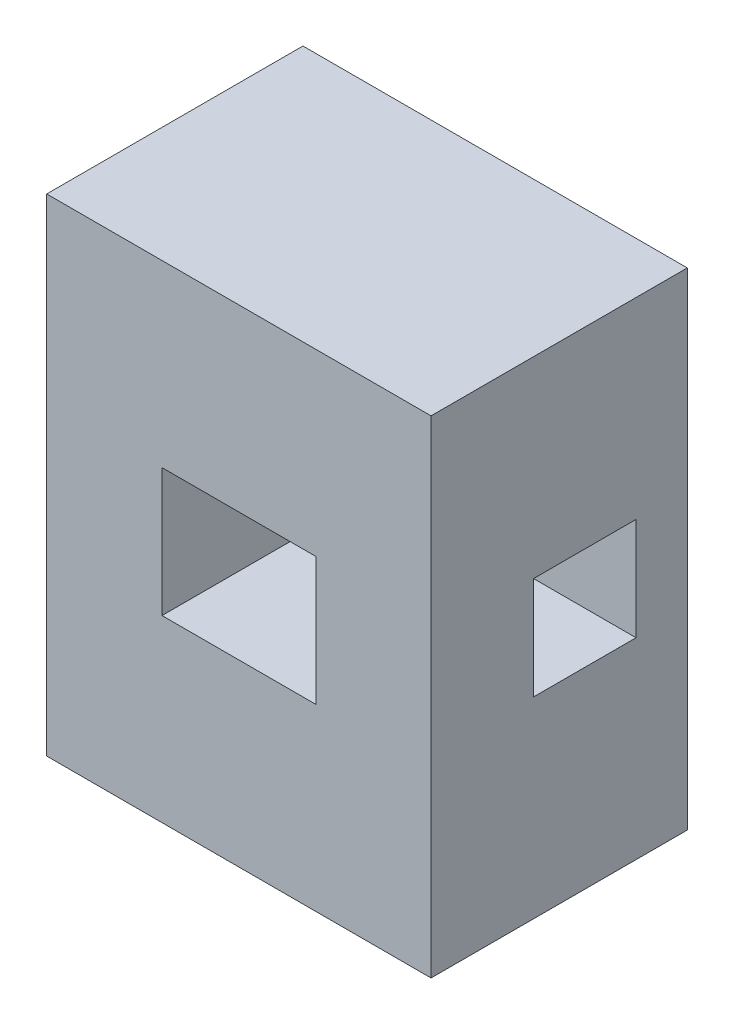
ISO-10303-21;
HEADER;
FILE_DESCRIPTION(('STEP AP214'),'2;1');
FILE_NAME('part.step','',(''),(''),'','','');
FILE_SCHEMA(('AUTOMOTIVE_DESIGN { 1 0 10303 214 1 1 1 1 }'));
ENDSEC;
DATA;
#1=APPLICATION_CONTEXT('core data for automotive mechanical design processes');
#2=APPLICATION_PROTOCOL_DEFINITION('international standard','automotive_design',2000,#1);
#3=PRODUCT_CONTEXT('',#1,'mechanical');
#4=PRODUCT('Part','Part','',(#3));
#5=PRODUCT_RELATED_PRODUCT_CATEGORY('part','',(#4));
#6=PRODUCT_DEFINITION_FORMATION('','',#4);
#7=PRODUCT_DEFINITION_CONTEXT('part definition',#1,'design');
#8=PRODUCT_DEFINITION('design','',#6,#7);
#9=PRODUCT_DEFINITION_SHAPE('','',#8);
#10=(LENGTH_UNIT() NAMED_UNIT(*) SI_UNIT(.MILLI.,.METRE.));
#11=(NAMED_UNIT(*) PLANE_ANGLE_UNIT() SI_UNIT($,.RADIAN.));
#12=(NAMED_UNIT(*) SI_UNIT($,.STERADIAN.) SOLID_ANGLE_UNIT());
#13=UNCERTAINTY_MEASURE_WITH_UNIT(LENGTH_MEASURE(1.E-05),#10,'distance_accuracy_value','');
#14=(GEOMETRIC_REPRESENTATION_CONTEXT(3) GLOBAL_UNCERTAINTY_ASSIGNED_CONTEXT((#13)) GLOBAL_UNIT_ASSIGNED_CONTEXT((#10,
#11,#12)) REPRESENTATION_CONTEXT('',''));
#15=CARTESIAN_POINT('',(0.,0.,0.));
#16=DIRECTION('',(0.,0.,1.));
#17=DIRECTION('',(1.,0.,0.));
#18=AXIS2_PLACEMENT_3D('',#15,#16,#17);
#19=CARTESIAN_POINT('',(21.,14.,-38.));
#20=DIRECTION('',(1.,0.,0.));
#21=DIRECTION('',(0.,0.,-1.));
#22=AXIS2_PLACEMENT_3D('',#19,#20,#21);
#23=PLANE('',#22);
#24=DIRECTION('',(0.,0.,1.));
#25=VECTOR('',#24,1.);
#26=CARTESIAN_POINT('',(21.,15.,-7.99999999999999));
#27=LINE('',#26,#25);
#28=CARTESIAN_POINT('',(21.,15.,-16.));
#29=VERTEX_POINT('',#28);
#30=CARTESIAN_POINT('',(21.,15.,-7.99999999999999));
#31=VERTEX_POINT('',#30);
#32=EDGE_CURVE('E155',#29,#31,#27,.T.);
#33=ORIENTED_EDGE('',*,*,#32,.F.);
#34=DIRECTION('',(0.,-1.,0.));
#35=VECTOR('',#34,1.);
#36=CARTESIAN_POINT('',(21.,15.,-16.));
#37=LINE('',#36,#35);
#38=CARTESIAN_POINT('',(21.,23.,-16.));
#39=VERTEX_POINT('',#38);
#40=EDGE_CURVE('E158',#39,#29,#37,.T.);
#41=ORIENTED_EDGE('',*,*,#40,.F.);
#42=DIRECTION('',(0.,0.,-1.));
#43=VECTOR('',#42,1.);
#44=CARTESIAN_POINT('',(21.,23.,-7.99999999999999));
#45=LINE('',#44,#43);
#46=CARTESIAN_POINT('',(21.,23.,-7.99999999999999));
#47=VERTEX_POINT('',#46);
#48=EDGE_CURVE('E160',#47,#39,#45,.T.);
#49=ORIENTED_EDGE('',*,*,#48,.F.);
#50=DIRECTION('',(0.,1.,0.));
#51=VECTOR('',#50,1.);
#52=CARTESIAN_POINT('',(21.,15.,-7.99999999999999));
#53=LINE('',#52,#51);
#54=EDGE_CURVE('E152',#31,#47,#53,.T.);
#55=ORIENTED_EDGE('',*,*,#54,.F.);
#56=EDGE_LOOP('',(#33,#41,#49,#55));
#57=FACE_BOUND('',#56,.T.);
#58=DIRECTION('',(0.,1.,0.));
#59=VECTOR('',#58,1.);
#60=CARTESIAN_POINT('',(21.,24.,-18.));
#61=LINE('',#60,#59);
#62=CARTESIAN_POINT('',(21.,14.,-18.));
#63=VERTEX_POINT('',#62);
#64=CARTESIAN_POINT('',(21.,24.,-18.));
#65=VERTEX_POINT('',#64);
#66=EDGE_CURVE('E54',#63,#65,#61,.T.);
#67=ORIENTED_EDGE('',*,*,#66,.F.);
#68=DIRECTION('',(0.,0.,1.));
#69=VECTOR('',#68,1.);
#70=CARTESIAN_POINT('',(21.,14.,-38.));
#71=LINE('',#70,#69);
#72=CARTESIAN_POINT('',(21.,14.,0.));
#73=VERTEX_POINT('',#72);
#74=EDGE_CURVE('E189',#63,#73,#71,.T.);
#75=ORIENTED_EDGE('',*,*,#74,.T.);
#76=DIRECTION('',(0.,1.,0.));
#77=VECTOR('',#76,1.);
#78=CARTESIAN_POINT('',(21.,14.,0.));
#79=LINE('',#78,#77);
#80=CARTESIAN_POINT('',(21.,24.,0.));
#81=VERTEX_POINT('',#80);
#82=EDGE_CURVE('E180',#73,#81,#79,.T.);
#83=ORIENTED_EDGE('',*,*,#82,.T.);
#84=DIRECTION('',(0.,0.,1.));
#85=VECTOR('',#84,1.);
#86=CARTESIAN_POINT('',(21.,24.,-38.));
#87=LINE('',#86,#85);
#88=EDGE_CURVE('E139',#65,#81,#87,.T.);
#89=ORIENTED_EDGE('',*,*,#88,.F.);
#90=EDGE_LOOP('',(#67,#75,#83,#89));
#91=FACE_BOUND('',#90,.T.);
#92=ADVANCED_FACE('F39',(#57,#91),#23,.F.);
#93=CARTESIAN_POINT('',(9.,14.,-38.));
#94=DIRECTION('',(0.,-1.,0.));
#95=DIRECTION('',(0.,0.,-1.));
#96=AXIS2_PLACEMENT_3D('',#93,#94,#95);
#97=PLANE('',#96);
#98=DIRECTION('',(1.,0.,0.));
#99=VECTOR('',#98,1.);
#100=CARTESIAN_POINT('',(-1.19803902718557,14.,-18.));
#101=LINE('',#100,#99);
#102=CARTESIAN_POINT('',(9.,14.,-18.));
#103=VERTEX_POINT('',#102);
#104=EDGE_CURVE('E61',#103,#63,#101,.T.);
#105=ORIENTED_EDGE('',*,*,#104,.F.);
#106=DIRECTION('',(0.,0.,1.));
#107=VECTOR('',#106,1.);
#108=CARTESIAN_POINT('',(9.,14.,-38.));
#109=LINE('',#108,#107);
#110=CARTESIAN_POINT('',(9.,14.,0.));
#111=VERTEX_POINT('',#110);
#112=EDGE_CURVE('E138',#103,#111,#109,.T.);
#113=ORIENTED_EDGE('',*,*,#112,.T.);
#114=DIRECTION('',(1.,0.,0.));
#115=VECTOR('',#114,1.);
#116=CARTESIAN_POINT('',(9.,14.,0.));
#117=LINE('',#116,#115);
#118=EDGE_CURVE('E186',#111,#73,#117,.T.);
#119=ORIENTED_EDGE('',*,*,#118,.T.);
#120=ORIENTED_EDGE('',*,*,#74,.F.);
#121=EDGE_LOOP('',(#105,#113,#119,#120));
#122=FACE_BOUND('',#121,.T.);
#123=ADVANCED_FACE('F247',(#122),#97,.F.);
#124=CARTESIAN_POINT('',(9.,14.,-38.));
#125=DIRECTION('',(-1.,0.,0.));
#126=DIRECTION('',(0.,0.,1.));
#127=AXIS2_PLACEMENT_3D('',#124,#125,#126);
#128=PLANE('',#127);
#129=DIRECTION('',(0.,1.,0.));
#130=VECTOR('',#129,1.);
#131=CARTESIAN_POINT('',(9.,24.,-18.));
#132=LINE('',#131,#130);
#133=CARTESIAN_POINT('',(9.,24.,-18.));
#134=VERTEX_POINT('',#133);
#135=EDGE_CURVE('E142',#103,#134,#132,.T.);
#136=ORIENTED_EDGE('',*,*,#135,.T.);
#137=DIRECTION('',(0.,0.,1.));
#138=VECTOR('',#137,1.);
#139=CARTESIAN_POINT('',(9.,24.,-38.));
#140=LINE('',#139,#138);
#141=CARTESIAN_POINT('',(9.,24.,0.));
#142=VERTEX_POINT('',#141);
#143=EDGE_CURVE('E128',#134,#142,#140,.T.);
#144=ORIENTED_EDGE('',*,*,#143,.T.);
#145=DIRECTION('',(0.,-1.,0.));
#146=VECTOR('',#145,1.);
#147=CARTESIAN_POINT('',(9.,14.,0.));
#148=LINE('',#147,#146);
#149=EDGE_CURVE('E184',#142,#111,#148,.T.);
#150=ORIENTED_EDGE('',*,*,#149,.T.);
#151=ORIENTED_EDGE('',*,*,#112,.F.);
#152=EDGE_LOOP('',(#136,#144,#150,#151));
#153=FACE_BOUND('',#152,.T.);
#154=ADVANCED_FACE('F143',(#153),#128,.F.);
#155=CARTESIAN_POINT('',(9.,24.,-38.));
#156=DIRECTION('',(0.,1.,0.));
#157=DIRECTION('',(0.,0.,1.));
#158=AXIS2_PLACEMENT_3D('',#155,#156,#157);
#159=PLANE('',#158);
#160=DIRECTION('',(1.,0.,0.));
#161=VECTOR('',#160,1.);
#162=CARTESIAN_POINT('',(-1.19803902718557,24.,-18.));
#163=LINE('',#162,#161);
#164=EDGE_CURVE('E132',#134,#65,#163,.T.);
#165=ORIENTED_EDGE('',*,*,#164,.T.);
#166=ORIENTED_EDGE('',*,*,#88,.T.);
#167=DIRECTION('',(-1.,0.,0.));
#168=VECTOR('',#167,1.);
#169=CARTESIAN_POINT('',(9.,24.,0.));
#170=LINE('',#169,#168);
#171=EDGE_CURVE('E134',#81,#142,#170,.T.);
#172=ORIENTED_EDGE('',*,*,#171,.T.);
#173=ORIENTED_EDGE('',*,*,#143,.F.);
#174=EDGE_LOOP('',(#165,#166,#172,#173));
#175=FACE_BOUND('',#174,.T.);
#176=ADVANCED_FACE('F130',(#175),#159,.F.);
#177=CARTESIAN_POINT('',(0.,38.,0.));
#178=DIRECTION('',(1.,0.,0.));
#179=DIRECTION('',(0.,0.,-1.));
#180=AXIS2_PLACEMENT_3D('',#177,#178,#179);
#181=PLANE('',#180);
#182=DIRECTION('',(0.,0.,1.));
#183=VECTOR('',#182,1.);
#184=CARTESIAN_POINT('',(0.,0.,0.));
#185=LINE('',#184,#183);
#186=CARTESIAN_POINT('',(0.,0.,-20.));
#187=VERTEX_POINT('',#186);
#188=CARTESIAN_POINT('',(0.,0.,0.));
#189=VERTEX_POINT('',#188);
#190=EDGE_CURVE('E191',#187,#189,#185,.T.);
#191=ORIENTED_EDGE('',*,*,#190,.T.);
#192=DIRECTION('',(0.,-1.,0.));
#193=VECTOR('',#192,1.);
#194=CARTESIAN_POINT('',(0.,38.,0.));
#195=LINE('',#194,#193);
#196=CARTESIAN_POINT('',(0.,38.,0.));
#197=VERTEX_POINT('',#196);
#198=EDGE_CURVE('E11',#197,#189,#195,.T.);
#199=ORIENTED_EDGE('',*,*,#198,.F.);
#200=DIRECTION('',(0.,0.,1.));
#201=VECTOR('',#200,1.);
#202=CARTESIAN_POINT('',(0.,38.,0.));
#203=LINE('',#202,#201);
#204=CARTESIAN_POINT('',(0.,38.,-20.));
#205=VERTEX_POINT('',#204);
#206=EDGE_CURVE('E194',#205,#197,#203,.T.);
#207=ORIENTED_EDGE('',*,*,#206,.F.);
#208=DIRECTION('',(0.,-1.,0.));
#209=VECTOR('',#208,1.);
#210=CARTESIAN_POINT('',(0.,38.,-20.));
#211=LINE('',#210,#209);
#212=EDGE_CURVE('E204',#205,#187,#211,.T.);
#213=ORIENTED_EDGE('',*,*,#212,.T.);
#214=EDGE_LOOP('',(#191,#199,#207,#213));
#215=FACE_BOUND('',#214,.T.);
#216=ADVANCED_FACE('F41',(#215),#181,.F.);
#217=CARTESIAN_POINT('',(0.,38.,0.));
#218=DIRECTION('',(0.,0.,-1.));
#219=DIRECTION('',(-1.,0.,0.));
#220=AXIS2_PLACEMENT_3D('',#217,#218,#219);
#221=PLANE('',#220);
#222=ORIENTED_EDGE('',*,*,#171,.F.);
#223=ORIENTED_EDGE('',*,*,#82,.F.);
#224=ORIENTED_EDGE('',*,*,#118,.F.);
#225=ORIENTED_EDGE('',*,*,#149,.F.);
#226=EDGE_LOOP('',(#222,#223,#224,#225));
#227=FACE_BOUND('',#226,.T.);
#228=DIRECTION('',(1.,0.,0.));
#229=VECTOR('',#228,1.);
#230=CARTESIAN_POINT('',(0.,0.,0.));
#231=LINE('',#230,#229);
#232=CARTESIAN_POINT('',(30.,0.,0.));
#233=VERTEX_POINT('',#232);
#234=EDGE_CURVE('E207',#189,#233,#231,.T.);
#235=ORIENTED_EDGE('',*,*,#234,.T.);
#236=DIRECTION('',(0.,-1.,0.));
#237=VECTOR('',#236,1.);
#238=CARTESIAN_POINT('',(30.,38.,0.));
#239=LINE('',#238,#237);
#240=CARTESIAN_POINT('',(30.,38.,0.));
#241=VERTEX_POINT('',#240);
#242=EDGE_CURVE('E47',#241,#233,#239,.T.);
#243=ORIENTED_EDGE('',*,*,#242,.F.);
#244=DIRECTION('',(1.,0.,0.));
#245=VECTOR('',#244,1.);
#246=CARTESIAN_POINT('',(0.,38.,0.));
#247=LINE('',#246,#245);
#248=EDGE_CURVE('E197',#197,#241,#247,.T.);
#249=ORIENTED_EDGE('',*,*,#248,.F.);
#250=ORIENTED_EDGE('',*,*,#198,.T.);
#251=EDGE_LOOP('',(#235,#243,#249,#250));
#252=FACE_BOUND('',#251,.T.);
#253=ADVANCED_FACE('F237',(#227,#252),#221,.F.);
#254=CARTESIAN_POINT('',(30.,38.,0.));
#255=DIRECTION('',(-1.,0.,0.));
#256=DIRECTION('',(0.,0.,1.));
#257=AXIS2_PLACEMENT_3D('',#254,#255,#256);
#258=PLANE('',#257);
#259=DIRECTION('',(0.,0.,1.));
#260=VECTOR('',#259,1.);
#261=CARTESIAN_POINT('',(30.,23.,-8.));
#262=LINE('',#261,#260);
#263=CARTESIAN_POINT('',(30.,23.,-16.));
#264=VERTEX_POINT('',#263);
#265=CARTESIAN_POINT('',(30.,23.,-8.));
#266=VERTEX_POINT('',#265);
#267=EDGE_CURVE('E162',#264,#266,#262,.T.);
#268=ORIENTED_EDGE('',*,*,#267,.F.);
#269=DIRECTION('',(0.,1.,0.));
#270=VECTOR('',#269,1.);
#271=CARTESIAN_POINT('',(30.,15.,-16.));
#272=LINE('',#271,#270);
#273=CARTESIAN_POINT('',(30.,15.,-16.));
#274=VERTEX_POINT('',#273);
#275=EDGE_CURVE('E145',#274,#264,#272,.T.);
#276=ORIENTED_EDGE('',*,*,#275,.F.);
#277=DIRECTION('',(0.,0.,-1.));
#278=VECTOR('',#277,1.);
#279=CARTESIAN_POINT('',(30.,15.,-8.));
#280=LINE('',#279,#278);
#281=CARTESIAN_POINT('',(30.,15.,-8.));
#282=VERTEX_POINT('',#281);
#283=EDGE_CURVE('E168',#282,#274,#280,.T.);
#284=ORIENTED_EDGE('',*,*,#283,.F.);
#285=DIRECTION('',(0.,-1.,0.));
#286=VECTOR('',#285,1.);
#287=CARTESIAN_POINT('',(30.,15.,-8.));
#288=LINE('',#287,#286);
#289=EDGE_CURVE('E165',#266,#282,#288,.T.);
#290=ORIENTED_EDGE('',*,*,#289,.F.);
#291=EDGE_LOOP('',(#268,#276,#284,#290));
#292=FACE_BOUND('',#291,.T.);
#293=DIRECTION('',(0.,0.,-1.));
#294=VECTOR('',#293,1.);
#295=CARTESIAN_POINT('',(30.,0.,0.));
#296=LINE('',#295,#294);
#297=CARTESIAN_POINT('',(30.,0.,-20.));
#298=VERTEX_POINT('',#297);
#299=EDGE_CURVE('E209',#233,#298,#296,.T.);
#300=ORIENTED_EDGE('',*,*,#299,.T.);
#301=DIRECTION('',(0.,-1.,0.));
#302=VECTOR('',#301,1.);
#303=CARTESIAN_POINT('',(30.,38.,-20.));
#304=LINE('',#303,#302);
#305=CARTESIAN_POINT('',(30.,38.,-20.));
#306=VERTEX_POINT('',#305);
#307=EDGE_CURVE('E214',#306,#298,#304,.T.);
#308=ORIENTED_EDGE('',*,*,#307,.F.);
#309=DIRECTION('',(0.,0.,-1.));
#310=VECTOR('',#309,1.);
#311=CARTESIAN_POINT('',(30.,38.,0.));
#312=LINE('',#311,#310);
#313=EDGE_CURVE('E200',#241,#306,#312,.T.);
#314=ORIENTED_EDGE('',*,*,#313,.F.);
#315=ORIENTED_EDGE('',*,*,#242,.T.);
#316=EDGE_LOOP('',(#300,#308,#314,#315));
#317=FACE_BOUND('',#316,.T.);
#318=ADVANCED_FACE('F221',(#292,#317),#258,.F.);
#319=CARTESIAN_POINT('',(0.,38.,-20.));
#320=DIRECTION('',(0.,0.,1.));
#321=DIRECTION('',(1.,0.,0.));
#322=AXIS2_PLACEMENT_3D('',#319,#320,#321);
#323=PLANE('',#322);
#324=DIRECTION('',(-1.,0.,0.));
#325=VECTOR('',#324,1.);
#326=CARTESIAN_POINT('',(0.,0.,-20.));
#327=LINE('',#326,#325);
#328=EDGE_CURVE('E198',#298,#187,#327,.T.);
#329=ORIENTED_EDGE('',*,*,#328,.T.);
#330=ORIENTED_EDGE('',*,*,#212,.F.);
#331=DIRECTION('',(-1.,0.,0.));
#332=VECTOR('',#331,1.);
#333=CARTESIAN_POINT('',(0.,38.,-20.));
#334=LINE('',#333,#332);
#335=EDGE_CURVE('E202',#306,#205,#334,.T.);
#336=ORIENTED_EDGE('',*,*,#335,.F.);
#337=ORIENTED_EDGE('',*,*,#307,.T.);
#338=EDGE_LOOP('',(#329,#330,#336,#337));
#339=FACE_BOUND('',#338,.T.);
#340=ADVANCED_FACE('F230',(#339),#323,.F.);
#341=CARTESIAN_POINT('',(0.,38.,0.));
#342=DIRECTION('',(0.,-1.,0.));
#343=DIRECTION('',(0.,0.,-1.));
#344=AXIS2_PLACEMENT_3D('',#341,#342,#343);
#345=PLANE('',#344);
#346=ORIENTED_EDGE('',*,*,#206,.T.);
#347=ORIENTED_EDGE('',*,*,#248,.T.);
#348=ORIENTED_EDGE('',*,*,#313,.T.);
#349=ORIENTED_EDGE('',*,*,#335,.T.);
#350=EDGE_LOOP('',(#346,#347,#348,#349));
#351=FACE_BOUND('',#350,.T.);
#352=ADVANCED_FACE('F236',(#351),#345,.F.);
#353=CARTESIAN_POINT('',(0.,0.,0.));
#354=DIRECTION('',(0.,-1.,0.));
#355=DIRECTION('',(0.,0.,-1.));
#356=AXIS2_PLACEMENT_3D('',#353,#354,#355);
#357=PLANE('',#356);
#358=ORIENTED_EDGE('',*,*,#190,.F.);
#359=ORIENTED_EDGE('',*,*,#328,.F.);
#360=ORIENTED_EDGE('',*,*,#299,.F.);
#361=ORIENTED_EDGE('',*,*,#234,.F.);
#362=EDGE_LOOP('',(#358,#359,#360,#361));
#363=FACE_BOUND('',#362,.T.);
#364=ADVANCED_FACE('F227',(#363),#357,.T.);
#365=CARTESIAN_POINT('',(9.68629150101523,15.,-16.));
#366=DIRECTION('',(0.,0.,-1.));
#367=DIRECTION('',(-1.,0.,0.));
#368=AXIS2_PLACEMENT_3D('',#365,#366,#367);
#369=PLANE('',#368);
#370=ORIENTED_EDGE('',*,*,#40,.T.);
#371=DIRECTION('',(1.,0.,0.));
#372=VECTOR('',#371,1.);
#373=CARTESIAN_POINT('',(9.68629150101523,15.,-16.));
#374=LINE('',#373,#372);
#375=EDGE_CURVE('E156',#29,#274,#374,.T.);
#376=ORIENTED_EDGE('',*,*,#375,.T.);
#377=ORIENTED_EDGE('',*,*,#275,.T.);
#378=DIRECTION('',(1.,0.,0.));
#379=VECTOR('',#378,1.);
#380=CARTESIAN_POINT('',(9.68629150101523,23.,-16.));
#381=LINE('',#380,#379);
#382=EDGE_CURVE('E171',#39,#264,#381,.T.);
#383=ORIENTED_EDGE('',*,*,#382,.F.);
#384=EDGE_LOOP('',(#370,#376,#377,#383));
#385=FACE_BOUND('',#384,.T.);
#386=ADVANCED_FACE('F262',(#385),#369,.F.);
#387=CARTESIAN_POINT('',(9.68629150101524,15.,-7.99999999999999));
#388=DIRECTION('',(0.,-1.,0.));
#389=DIRECTION('',(0.,0.,-1.));
#390=AXIS2_PLACEMENT_3D('',#387,#388,#389);
#391=PLANE('',#390);
#392=ORIENTED_EDGE('',*,*,#32,.T.);
#393=DIRECTION('',(1.,0.,0.));
#394=VECTOR('',#393,1.);
#395=CARTESIAN_POINT('',(9.68629150101524,15.,-7.99999999999999));
#396=LINE('',#395,#394);
#397=EDGE_CURVE('E173',#31,#282,#396,.T.);
#398=ORIENTED_EDGE('',*,*,#397,.T.);
#399=ORIENTED_EDGE('',*,*,#283,.T.);
#400=ORIENTED_EDGE('',*,*,#375,.F.);
#401=EDGE_LOOP('',(#392,#398,#399,#400));
#402=FACE_BOUND('',#401,.T.);
#403=ADVANCED_FACE('F285',(#402),#391,.F.);
#404=CARTESIAN_POINT('',(9.68629150101524,15.,-7.99999999999999));
#405=DIRECTION('',(0.,0.,1.));
#406=DIRECTION('',(1.,0.,0.));
#407=AXIS2_PLACEMENT_3D('',#404,#405,#406);
#408=PLANE('',#407);
#409=ORIENTED_EDGE('',*,*,#54,.T.);
#410=DIRECTION('',(1.,0.,0.));
#411=VECTOR('',#410,1.);
#412=CARTESIAN_POINT('',(9.68629150101524,23.,-7.99999999999999));
#413=LINE('',#412,#411);
#414=EDGE_CURVE('E175',#47,#266,#413,.T.);
#415=ORIENTED_EDGE('',*,*,#414,.T.);
#416=ORIENTED_EDGE('',*,*,#289,.T.);
#417=ORIENTED_EDGE('',*,*,#397,.F.);
#418=EDGE_LOOP('',(#409,#415,#416,#417));
#419=FACE_BOUND('',#418,.T.);
#420=ADVANCED_FACE('F293',(#419),#408,.F.);
#421=CARTESIAN_POINT('',(9.68629150101524,23.,-7.99999999999999));
#422=DIRECTION('',(0.,1.,0.));
#423=DIRECTION('',(0.,0.,1.));
#424=AXIS2_PLACEMENT_3D('',#421,#422,#423);
#425=PLANE('',#424);
#426=ORIENTED_EDGE('',*,*,#48,.T.);
#427=ORIENTED_EDGE('',*,*,#382,.T.);
#428=ORIENTED_EDGE('',*,*,#267,.T.);
#429=ORIENTED_EDGE('',*,*,#414,.F.);
#430=EDGE_LOOP('',(#426,#427,#428,#429));
#431=FACE_BOUND('',#430,.T.);
#432=ADVANCED_FACE('F301',(#431),#425,.F.);
#433=CARTESIAN_POINT('',(-1.19803902718557,24.,-18.));
#434=DIRECTION('',(0.,0.,-1.));
#435=DIRECTION('',(-1.,0.,0.));
#436=AXIS2_PLACEMENT_3D('',#433,#434,#435);
#437=PLANE('',#436);
#438=ORIENTED_EDGE('',*,*,#135,.F.);
#439=ORIENTED_EDGE('',*,*,#104,.T.);
#440=ORIENTED_EDGE('',*,*,#66,.T.);
#441=ORIENTED_EDGE('',*,*,#164,.F.);
#442=EDGE_LOOP('',(#438,#439,#440,#441));
#443=FACE_BOUND('',#442,.T.);
#444=ADVANCED_FACE('F147',(#443),#437,.F.);
#445=CLOSED_SHELL('',(#92,#123,#154,#176,#216,#253,#318,#340,#352,#364,#386,#403,#420,#432,#444));
#446=MANIFOLD_SOLID_BREP('B2',#445);
#447=ADVANCED_BREP_SHAPE_REPRESENTATION('',(#18,#446),#14);
#448=SHAPE_DEFINITION_REPRESENTATION(#9,#447);
ENDSEC;
END-ISO-10303-21;
